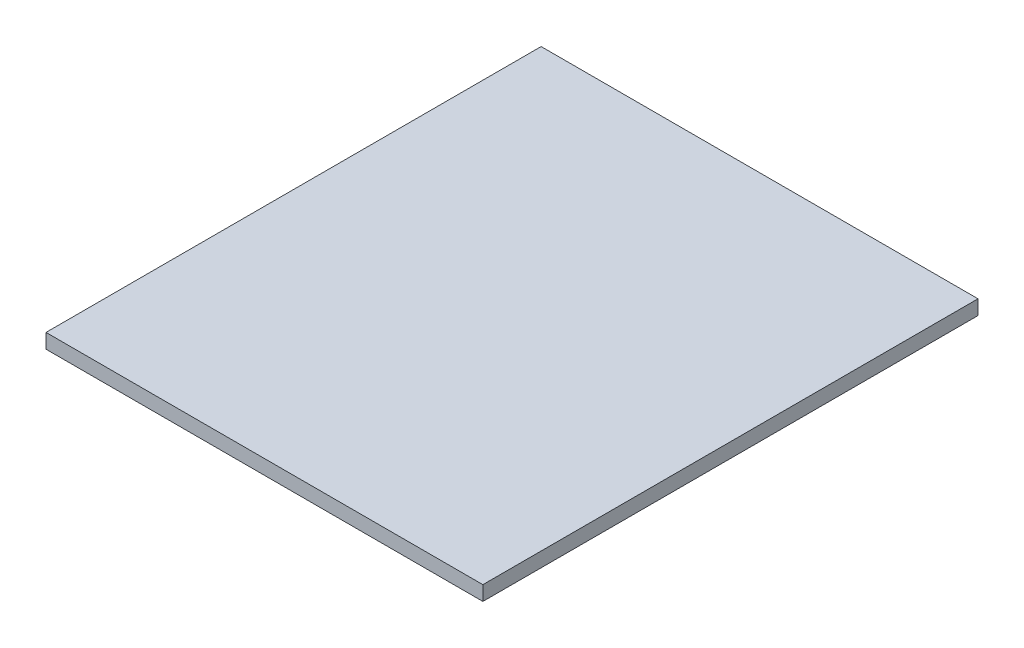
ISO-10303-21;
HEADER;
FILE_DESCRIPTION(('STEP AP214'),'2;1');
FILE_NAME('part.step','',(''),(''),'','','');
FILE_SCHEMA(('AUTOMOTIVE_DESIGN { 1 0 10303 214 1 1 1 1 }'));
ENDSEC;
DATA;
#1=APPLICATION_CONTEXT('core data for automotive mechanical design processes');
#2=APPLICATION_PROTOCOL_DEFINITION('international standard','automotive_design',2000,#1);
#3=PRODUCT_CONTEXT('',#1,'mechanical');
#4=PRODUCT('Part','Part','',(#3));
#5=PRODUCT_RELATED_PRODUCT_CATEGORY('part','',(#4));
#6=PRODUCT_DEFINITION_FORMATION('','',#4);
#7=PRODUCT_DEFINITION_CONTEXT('part definition',#1,'design');
#8=PRODUCT_DEFINITION('design','',#6,#7);
#9=PRODUCT_DEFINITION_SHAPE('','',#8);
#10=(LENGTH_UNIT() NAMED_UNIT(*) SI_UNIT(.MILLI.,.METRE.));
#11=(NAMED_UNIT(*) PLANE_ANGLE_UNIT() SI_UNIT($,.RADIAN.));
#12=(NAMED_UNIT(*) SI_UNIT($,.STERADIAN.) SOLID_ANGLE_UNIT());
#13=UNCERTAINTY_MEASURE_WITH_UNIT(LENGTH_MEASURE(1.E-05),#10,'distance_accuracy_value','');
#14=(GEOMETRIC_REPRESENTATION_CONTEXT(3) GLOBAL_UNCERTAINTY_ASSIGNED_CONTEXT((#13)) GLOBAL_UNIT_ASSIGNED_CONTEXT((#10,
#11,#12)) REPRESENTATION_CONTEXT('',''));
#15=CARTESIAN_POINT('',(0.,0.,0.));
#16=DIRECTION('',(0.,0.,1.));
#17=DIRECTION('',(1.,0.,0.));
#18=AXIS2_PLACEMENT_3D('',#15,#16,#17);
#19=CARTESIAN_POINT('',(-77.3921200750469,5.,-130.037523452158));
#20=DIRECTION('',(1.,0.,0.));
#21=DIRECTION('',(0.,0.,-1.));
#22=AXIS2_PLACEMENT_3D('',#19,#20,#21);
#23=PLANE('',#22);
#24=DIRECTION('',(0.,0.,1.));
#25=VECTOR('',#24,1.);
#26=CARTESIAN_POINT('',(-77.3921200750469,0.,-130.037523452158));
#27=LINE('',#26,#25);
#28=CARTESIAN_POINT('',(-77.3921200750469,0.,-130.037523452158));
#29=VERTEX_POINT('',#28);
#30=CARTESIAN_POINT('',(-77.3921200750469,0.,39.9624765478424));
#31=VERTEX_POINT('',#30);
#32=EDGE_CURVE('E107',#29,#31,#27,.T.);
#33=ORIENTED_EDGE('',*,*,#32,.T.);
#34=DIRECTION('',(0.,-1.,0.));
#35=VECTOR('',#34,1.);
#36=CARTESIAN_POINT('',(-77.3921200750469,5.,39.9624765478424));
#37=LINE('',#36,#35);
#38=CARTESIAN_POINT('',(-77.3921200750469,5.,39.9624765478424));
#39=VERTEX_POINT('',#38);
#40=EDGE_CURVE('E11',#39,#31,#37,.T.);
#41=ORIENTED_EDGE('',*,*,#40,.F.);
#42=DIRECTION('',(0.,0.,1.));
#43=VECTOR('',#42,1.);
#44=CARTESIAN_POINT('',(-77.3921200750469,5.,-130.037523452158));
#45=LINE('',#44,#43);
#46=CARTESIAN_POINT('',(-77.3921200750469,5.,-130.037523452158));
#47=VERTEX_POINT('',#46);
#48=EDGE_CURVE('E91',#47,#39,#45,.T.);
#49=ORIENTED_EDGE('',*,*,#48,.F.);
#50=DIRECTION('',(0.,-1.,0.));
#51=VECTOR('',#50,1.);
#52=CARTESIAN_POINT('',(-77.3921200750469,5.,-130.037523452158));
#53=LINE('',#52,#51);
#54=EDGE_CURVE('E103',#47,#29,#53,.T.);
#55=ORIENTED_EDGE('',*,*,#54,.T.);
#56=EDGE_LOOP('',(#33,#41,#49,#55));
#57=FACE_BOUND('',#56,.T.);
#58=ADVANCED_FACE('F39',(#57),#23,.F.);
#59=CARTESIAN_POINT('',(-77.3921200750469,5.,39.9624765478424));
#60=DIRECTION('',(0.,0.,-1.));
#61=DIRECTION('',(-1.,0.,0.));
#62=AXIS2_PLACEMENT_3D('',#59,#60,#61);
#63=PLANE('',#62);
#64=DIRECTION('',(1.,0.,0.));
#65=VECTOR('',#64,1.);
#66=CARTESIAN_POINT('',(-77.3921200750469,0.,39.9624765478424));
#67=LINE('',#66,#65);
#68=CARTESIAN_POINT('',(72.607879924953,0.,39.9624765478424));
#69=VERTEX_POINT('',#68);
#70=EDGE_CURVE('E96',#31,#69,#67,.T.);
#71=ORIENTED_EDGE('',*,*,#70,.T.);
#72=DIRECTION('',(0.,-1.,0.));
#73=VECTOR('',#72,1.);
#74=CARTESIAN_POINT('',(72.607879924953,5.,39.9624765478424));
#75=LINE('',#74,#73);
#76=CARTESIAN_POINT('',(72.607879924953,5.,39.9624765478424));
#77=VERTEX_POINT('',#76);
#78=EDGE_CURVE('E48',#77,#69,#75,.T.);
#79=ORIENTED_EDGE('',*,*,#78,.F.);
#80=DIRECTION('',(1.,0.,0.));
#81=VECTOR('',#80,1.);
#82=CARTESIAN_POINT('',(-77.3921200750469,5.,39.9624765478424));
#83=LINE('',#82,#81);
#84=EDGE_CURVE('E86',#39,#77,#83,.T.);
#85=ORIENTED_EDGE('',*,*,#84,.F.);
#86=ORIENTED_EDGE('',*,*,#40,.T.);
#87=EDGE_LOOP('',(#71,#79,#85,#86));
#88=FACE_BOUND('',#87,.T.);
#89=ADVANCED_FACE('F95',(#88),#63,.F.);
#90=CARTESIAN_POINT('',(72.6078799249531,5.,-130.037523452158));
#91=DIRECTION('',(-1.,0.,0.));
#92=DIRECTION('',(0.,0.,1.));
#93=AXIS2_PLACEMENT_3D('',#90,#91,#92);
#94=PLANE('',#93);
#95=DIRECTION('',(0.,0.,-1.));
#96=VECTOR('',#95,1.);
#97=CARTESIAN_POINT('',(72.6078799249531,0.,-130.037523452158));
#98=LINE('',#97,#96);
#99=CARTESIAN_POINT('',(72.6078799249531,0.,-130.037523452158));
#100=VERTEX_POINT('',#99);
#101=EDGE_CURVE('E73',#69,#100,#98,.T.);
#102=ORIENTED_EDGE('',*,*,#101,.T.);
#103=DIRECTION('',(0.,-1.,0.));
#104=VECTOR('',#103,1.);
#105=CARTESIAN_POINT('',(72.6078799249531,5.,-130.037523452158));
#106=LINE('',#105,#104);
#107=CARTESIAN_POINT('',(72.6078799249531,5.,-130.037523452158));
#108=VERTEX_POINT('',#107);
#109=EDGE_CURVE('E98',#108,#100,#106,.T.);
#110=ORIENTED_EDGE('',*,*,#109,.F.);
#111=DIRECTION('',(0.,0.,-1.));
#112=VECTOR('',#111,1.);
#113=CARTESIAN_POINT('',(72.6078799249531,5.,-130.037523452158));
#114=LINE('',#113,#112);
#115=EDGE_CURVE('E89',#77,#108,#114,.T.);
#116=ORIENTED_EDGE('',*,*,#115,.F.);
#117=ORIENTED_EDGE('',*,*,#78,.T.);
#118=EDGE_LOOP('',(#102,#110,#116,#117));
#119=FACE_BOUND('',#118,.T.);
#120=ADVANCED_FACE('F99',(#119),#94,.F.);
#121=CARTESIAN_POINT('',(-77.3921200750469,5.,-130.037523452158));
#122=DIRECTION('',(0.,0.,1.));
#123=DIRECTION('',(1.,0.,0.));
#124=AXIS2_PLACEMENT_3D('',#121,#122,#123);
#125=PLANE('',#124);
#126=DIRECTION('',(-1.,0.,0.));
#127=VECTOR('',#126,1.);
#128=CARTESIAN_POINT('',(-77.3921200750469,0.,-130.037523452158));
#129=LINE('',#128,#127);
#130=EDGE_CURVE('E79',#100,#29,#129,.T.);
#131=ORIENTED_EDGE('',*,*,#130,.T.);
#132=ORIENTED_EDGE('',*,*,#54,.F.);
#133=DIRECTION('',(-1.,0.,0.));
#134=VECTOR('',#133,1.);
#135=CARTESIAN_POINT('',(-77.3921200750469,5.,-130.037523452158));
#136=LINE('',#135,#134);
#137=EDGE_CURVE('E56',#108,#47,#136,.T.);
#138=ORIENTED_EDGE('',*,*,#137,.F.);
#139=ORIENTED_EDGE('',*,*,#109,.T.);
#140=EDGE_LOOP('',(#131,#132,#138,#139));
#141=FACE_BOUND('',#140,.T.);
#142=ADVANCED_FACE('F120',(#141),#125,.F.);
#143=CARTESIAN_POINT('',(0.,5.,0.));
#144=DIRECTION('',(0.,1.,0.));
#145=DIRECTION('',(0.,0.,1.));
#146=AXIS2_PLACEMENT_3D('',#143,#144,#145);
#147=PLANE('',#146);
#148=ORIENTED_EDGE('',*,*,#48,.T.);
#149=ORIENTED_EDGE('',*,*,#84,.T.);
#150=ORIENTED_EDGE('',*,*,#115,.T.);
#151=ORIENTED_EDGE('',*,*,#137,.T.);
#152=EDGE_LOOP('',(#148,#149,#150,#151));
#153=FACE_BOUND('',#152,.T.);
#154=ADVANCED_FACE('F87',(#153),#147,.T.);
#155=CARTESIAN_POINT('',(0.,0.,0.));
#156=DIRECTION('',(0.,1.,0.));
#157=DIRECTION('',(0.,0.,1.));
#158=AXIS2_PLACEMENT_3D('',#155,#156,#157);
#159=PLANE('',#158);
#160=ORIENTED_EDGE('',*,*,#32,.F.);
#161=ORIENTED_EDGE('',*,*,#130,.F.);
#162=ORIENTED_EDGE('',*,*,#101,.F.);
#163=ORIENTED_EDGE('',*,*,#70,.F.);
#164=EDGE_LOOP('',(#160,#161,#162,#163));
#165=FACE_BOUND('',#164,.T.);
#166=ADVANCED_FACE('F123',(#165),#159,.F.);
#167=CLOSED_SHELL('',(#58,#89,#120,#142,#154,#166));
#168=MANIFOLD_SOLID_BREP('B2',#167);
#169=ADVANCED_BREP_SHAPE_REPRESENTATION('',(#18,#168),#14);
#170=SHAPE_DEFINITION_REPRESENTATION(#9,#169);
ENDSEC;
END-ISO-10303-21;
